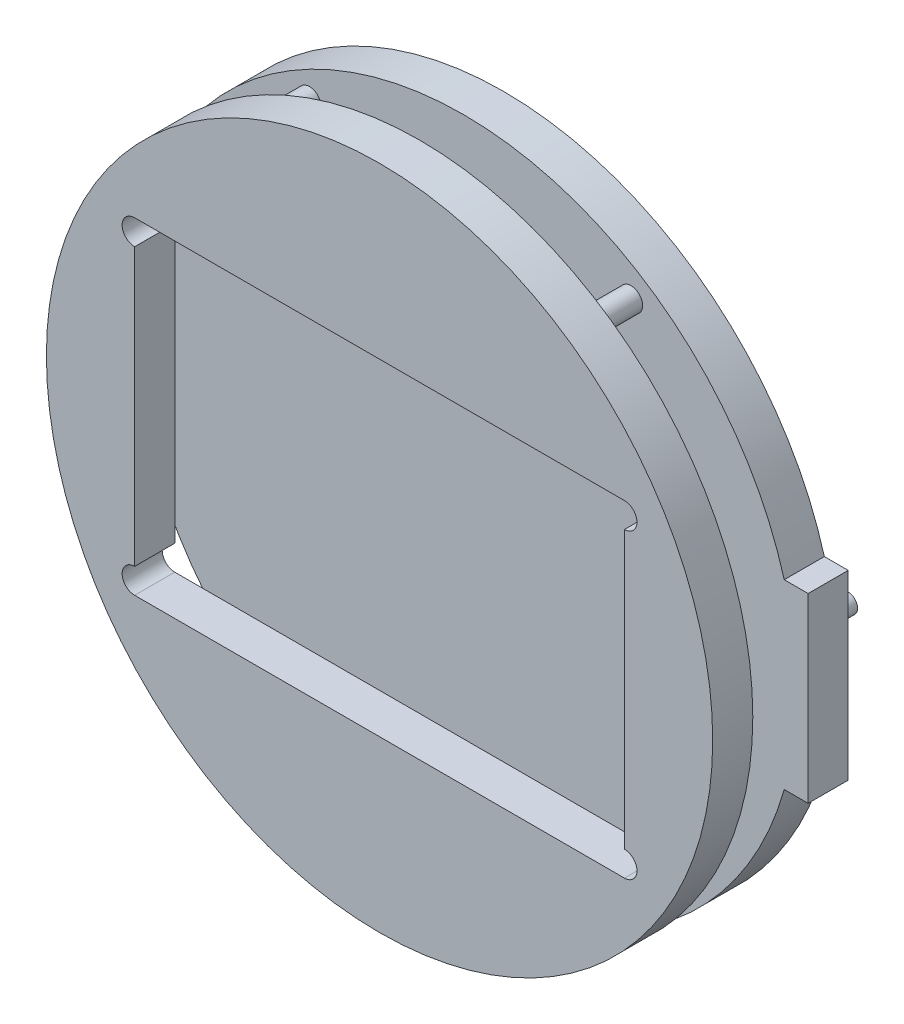
ISO-10303-21;
HEADER;
FILE_DESCRIPTION(('STEP AP214'),'2;1');
FILE_NAME('part.step','',(''),(''),'','','');
FILE_SCHEMA(('AUTOMOTIVE_DESIGN { 1 0 10303 214 1 1 1 1 }'));
ENDSEC;
DATA;
#1=APPLICATION_CONTEXT('core data for automotive mechanical design processes');
#2=APPLICATION_PROTOCOL_DEFINITION('international standard','automotive_design',2000,#1);
#3=PRODUCT_CONTEXT('',#1,'mechanical');
#4=PRODUCT('Part','Part','',(#3));
#5=PRODUCT_RELATED_PRODUCT_CATEGORY('part','',(#4));
#6=PRODUCT_DEFINITION_FORMATION('','',#4);
#7=PRODUCT_DEFINITION_CONTEXT('part definition',#1,'design');
#8=PRODUCT_DEFINITION('design','',#6,#7);
#9=PRODUCT_DEFINITION_SHAPE('','',#8);
#10=(LENGTH_UNIT() NAMED_UNIT(*) SI_UNIT(.MILLI.,.METRE.));
#11=(NAMED_UNIT(*) PLANE_ANGLE_UNIT() SI_UNIT($,.RADIAN.));
#12=(NAMED_UNIT(*) SI_UNIT($,.STERADIAN.) SOLID_ANGLE_UNIT());
#13=UNCERTAINTY_MEASURE_WITH_UNIT(LENGTH_MEASURE(1.E-05),#10,'distance_accuracy_value','');
#14=(GEOMETRIC_REPRESENTATION_CONTEXT(3) GLOBAL_UNCERTAINTY_ASSIGNED_CONTEXT((#13)) GLOBAL_UNIT_ASSIGNED_CONTEXT((#10,
#11,#12)) REPRESENTATION_CONTEXT('',''));
#15=CARTESIAN_POINT('',(0.,0.,0.));
#16=DIRECTION('',(0.,0.,1.));
#17=DIRECTION('',(1.,0.,0.));
#18=AXIS2_PLACEMENT_3D('',#15,#16,#17);
#19=CARTESIAN_POINT('',(0.,0.,-3.4036));
#20=DIRECTION('',(0.,0.,-1.));
#21=DIRECTION('',(-1.,0.,0.));
#22=AXIS2_PLACEMENT_3D('',#19,#20,#21);
#23=PLANE('',#22);
#24=CARTESIAN_POINT('',(11.43,0.,-3.4036));
#25=DIRECTION('',(0.,0.,-1.));
#26=DIRECTION('',(-1.,0.,0.));
#27=AXIS2_PLACEMENT_3D('',#24,#25,#26);
#28=CIRCLE('',#27,0.381000000000001);
#29=CARTESIAN_POINT('',(11.049,0.,-3.4036));
#30=VERTEX_POINT('',#29);
#31=EDGE_CURVE('E177',#30,#30,#28,.T.);
#32=ORIENTED_EDGE('',*,*,#31,.F.);
#33=EDGE_LOOP('',(#32));
#34=FACE_BOUND('',#33,.T.);
#35=CARTESIAN_POINT('',(0.,0.,-3.4036));
#36=DIRECTION('',(0.,0.,-1.));
#37=DIRECTION('',(-1.,0.,0.));
#38=AXIS2_PLACEMENT_3D('',#35,#36,#37);
#39=CIRCLE('',#38,13.5128);
#40=CARTESIAN_POINT('',(-13.001202822816,3.683,-3.4036));
#41=VERTEX_POINT('',#40);
#42=CARTESIAN_POINT('',(13.001202822816,3.683,-3.4036));
#43=VERTEX_POINT('',#42);
#44=EDGE_CURVE('E204',#41,#43,#39,.T.);
#45=ORIENTED_EDGE('',*,*,#44,.T.);
#46=DIRECTION('',(1.,0.,0.));
#47=VECTOR('',#46,1.);
#48=CARTESIAN_POINT('',(13.97,3.683,-3.4036));
#49=LINE('',#48,#47);
#50=CARTESIAN_POINT('',(13.97,3.683,-3.4036));
#51=VERTEX_POINT('',#50);
#52=EDGE_CURVE('E167',#43,#51,#49,.T.);
#53=ORIENTED_EDGE('',*,*,#52,.T.);
#54=DIRECTION('',(0.,-1.,0.));
#55=VECTOR('',#54,1.);
#56=CARTESIAN_POINT('',(13.97,3.683,-3.4036));
#57=LINE('',#56,#55);
#58=CARTESIAN_POINT('',(13.97,-3.683,-3.4036));
#59=VERTEX_POINT('',#58);
#60=EDGE_CURVE('E166',#51,#59,#57,.T.);
#61=ORIENTED_EDGE('',*,*,#60,.T.);
#62=DIRECTION('',(-1.,0.,0.));
#63=VECTOR('',#62,1.);
#64=CARTESIAN_POINT('',(13.97,-3.683,-3.4036));
#65=LINE('',#64,#63);
#66=CARTESIAN_POINT('',(13.001202822816,-3.683,-3.4036));
#67=VERTEX_POINT('',#66);
#68=EDGE_CURVE('E157',#59,#67,#65,.T.);
#69=ORIENTED_EDGE('',*,*,#68,.T.);
#70=CARTESIAN_POINT('',(-13.001202822816,-3.683,-3.4036));
#71=VERTEX_POINT('',#70);
#72=EDGE_CURVE('E207',#67,#71,#39,.T.);
#73=ORIENTED_EDGE('',*,*,#72,.T.);
#74=CARTESIAN_POINT('',(-13.97,-3.683,-3.4036));
#75=VERTEX_POINT('',#74);
#76=EDGE_CURVE('E172',#71,#75,#65,.T.);
#77=ORIENTED_EDGE('',*,*,#76,.T.);
#78=DIRECTION('',(0.,1.,0.));
#79=VECTOR('',#78,1.);
#80=CARTESIAN_POINT('',(-13.97,3.683,-3.4036));
#81=LINE('',#80,#79);
#82=CARTESIAN_POINT('',(-13.97,3.683,-3.4036));
#83=VERTEX_POINT('',#82);
#84=EDGE_CURVE('E152',#75,#83,#81,.T.);
#85=ORIENTED_EDGE('',*,*,#84,.T.);
#86=EDGE_CURVE('E161',#83,#41,#49,.T.);
#87=ORIENTED_EDGE('',*,*,#86,.T.);
#88=EDGE_LOOP('',(#45,#53,#61,#69,#73,#77,#85,#87));
#89=FACE_BOUND('',#88,.T.);
#90=CARTESIAN_POINT('',(-11.43,0.,-3.4036));
#91=DIRECTION('',(0.,0.,-1.));
#92=DIRECTION('',(1.,0.,0.));
#93=AXIS2_PLACEMENT_3D('',#90,#91,#92);
#94=CIRCLE('',#93,0.381000000000001);
#95=CARTESIAN_POINT('',(-11.049,0.,-3.4036));
#96=VERTEX_POINT('',#95);
#97=EDGE_CURVE('E373',#96,#96,#94,.T.);
#98=ORIENTED_EDGE('',*,*,#97,.F.);
#99=EDGE_LOOP('',(#98));
#100=FACE_BOUND('',#99,.T.);
#101=ADVANCED_FACE('F33',(#34,#89,#100),#23,.T.);
#102=CARTESIAN_POINT('',(0.,0.,-3.4036));
#103=DIRECTION('',(0.,0.,1.));
#104=DIRECTION('',(1.,0.,0.));
#105=AXIS2_PLACEMENT_3D('',#102,#103,#104);
#106=CYLINDRICAL_SURFACE('',#105,13.5128);
#107=ORIENTED_EDGE('',*,*,#72,.F.);
#108=DIRECTION('',(0.,0.,1.));
#109=VECTOR('',#108,1.);
#110=CARTESIAN_POINT('',(13.001202822816,-3.683,-3.4036));
#111=LINE('',#110,#109);
#112=CARTESIAN_POINT('',(13.001202822816,-3.683,-1.778));
#113=VERTEX_POINT('',#112);
#114=EDGE_CURVE('E202',#67,#113,#111,.T.);
#115=ORIENTED_EDGE('',*,*,#114,.T.);
#116=CARTESIAN_POINT('',(0.,0.,-1.778));
#117=DIRECTION('',(0.,0.,-1.));
#118=DIRECTION('',(-1.,0.,0.));
#119=AXIS2_PLACEMENT_3D('',#116,#117,#118);
#120=CIRCLE('',#119,13.5128);
#121=CARTESIAN_POINT('',(-13.001202822816,-3.683,-1.778));
#122=VERTEX_POINT('',#121);
#123=EDGE_CURVE('E48',#113,#122,#120,.T.);
#124=ORIENTED_EDGE('',*,*,#123,.T.);
#125=DIRECTION('',(0.,0.,1.));
#126=VECTOR('',#125,1.);
#127=CARTESIAN_POINT('',(-13.001202822816,-3.683,-3.4036));
#128=LINE('',#127,#126);
#129=EDGE_CURVE('E200',#122,#71,#128,.F.);
#130=ORIENTED_EDGE('',*,*,#129,.T.);
#131=EDGE_LOOP('',(#107,#115,#124,#130));
#132=FACE_BOUND('',#131,.T.);
#133=ADVANCED_FACE('F305',(#132),#106,.T.);
#134=CARTESIAN_POINT('',(0.,0.,0.));
#135=DIRECTION('',(0.,0.,1.));
#136=DIRECTION('',(1.,0.,0.));
#137=AXIS2_PLACEMENT_3D('',#134,#135,#136);
#138=PLANE('',#137);
#139=CARTESIAN_POINT('',(-5.42225666710933,-10.7623579301716,0.));
#140=DIRECTION('',(0.,0.,1.));
#141=DIRECTION('',(1.,0.,0.));
#142=AXIS2_PLACEMENT_3D('',#139,#140,#141);
#143=CIRCLE('',#142,0.612350227227674);
#144=CARTESIAN_POINT('',(-4.80990643988165,-10.7623579301716,0.));
#145=VERTEX_POINT('',#144);
#146=EDGE_CURVE('E41',#145,#145,#143,.F.);
#147=ORIENTED_EDGE('',*,*,#146,.F.);
#148=EDGE_LOOP('',(#147));
#149=FACE_BOUND('',#148,.T.);
#150=CARTESIAN_POINT('',(6.79151340122786,10.4337363139831,0.));
#151=DIRECTION('',(0.,0.,1.));
#152=DIRECTION('',(1.,0.,0.));
#153=AXIS2_PLACEMENT_3D('',#150,#151,#152);
#154=CIRCLE('',#153,0.467957386584394);
#155=CARTESIAN_POINT('',(7.25947078781225,10.4337363139831,0.));
#156=VERTEX_POINT('',#155);
#157=EDGE_CURVE('E292',#156,#156,#154,.F.);
#158=ORIENTED_EDGE('',*,*,#157,.F.);
#159=EDGE_LOOP('',(#158));
#160=FACE_BOUND('',#159,.T.);
#161=DIRECTION('',(0.,1.,0.));
#162=VECTOR('',#161,1.);
#163=CARTESIAN_POINT('',(9.927,6.627,0.));
#164=LINE('',#163,#162);
#165=CARTESIAN_POINT('',(9.927,-5.611,0.));
#166=VERTEX_POINT('',#165);
#167=CARTESIAN_POINT('',(9.927,5.611,0.));
#168=VERTEX_POINT('',#167);
#169=EDGE_CURVE('E257',#166,#168,#164,.T.);
#170=ORIENTED_EDGE('',*,*,#169,.T.);
#171=CARTESIAN_POINT('',(9.927,6.119,0.));
#172=DIRECTION('',(0.,0.,1.));
#173=DIRECTION('',(1.,0.,0.));
#174=AXIS2_PLACEMENT_3D('',#171,#172,#173);
#175=CIRCLE('',#174,0.508);
#176=CARTESIAN_POINT('',(9.927,6.627,0.));
#177=VERTEX_POINT('',#176);
#178=EDGE_CURVE('E221',#168,#177,#175,.T.);
#179=ORIENTED_EDGE('',*,*,#178,.T.);
#180=DIRECTION('',(-1.,0.,0.));
#181=VECTOR('',#180,1.);
#182=CARTESIAN_POINT('',(-9.927,6.627,0.));
#183=LINE('',#182,#181);
#184=CARTESIAN_POINT('',(-9.927,6.627,0.));
#185=VERTEX_POINT('',#184);
#186=EDGE_CURVE('E260',#177,#185,#183,.T.);
#187=ORIENTED_EDGE('',*,*,#186,.T.);
#188=CARTESIAN_POINT('',(-9.927,6.119,0.));
#189=DIRECTION('',(0.,0.,1.));
#190=DIRECTION('',(1.,0.,0.));
#191=AXIS2_PLACEMENT_3D('',#188,#189,#190);
#192=CIRCLE('',#191,0.508);
#193=CARTESIAN_POINT('',(-9.927,5.611,0.));
#194=VERTEX_POINT('',#193);
#195=EDGE_CURVE('E242',#185,#194,#192,.T.);
#196=ORIENTED_EDGE('',*,*,#195,.T.);
#197=DIRECTION('',(0.,-1.,0.));
#198=VECTOR('',#197,1.);
#199=CARTESIAN_POINT('',(-9.927,6.627,0.));
#200=LINE('',#199,#198);
#201=CARTESIAN_POINT('',(-9.927,-5.611,0.));
#202=VERTEX_POINT('',#201);
#203=EDGE_CURVE('E250',#194,#202,#200,.T.);
#204=ORIENTED_EDGE('',*,*,#203,.T.);
#205=CARTESIAN_POINT('',(-9.927,-6.119,0.));
#206=DIRECTION('',(0.,0.,1.));
#207=DIRECTION('',(1.,0.,0.));
#208=AXIS2_PLACEMENT_3D('',#205,#206,#207);
#209=CIRCLE('',#208,0.508);
#210=CARTESIAN_POINT('',(-9.927,-6.627,0.));
#211=VERTEX_POINT('',#210);
#212=EDGE_CURVE('E234',#202,#211,#209,.T.);
#213=ORIENTED_EDGE('',*,*,#212,.T.);
#214=DIRECTION('',(1.,0.,0.));
#215=VECTOR('',#214,1.);
#216=CARTESIAN_POINT('',(-9.927,-6.627,0.));
#217=LINE('',#216,#215);
#218=CARTESIAN_POINT('',(9.927,-6.627,0.));
#219=VERTEX_POINT('',#218);
#220=EDGE_CURVE('E253',#211,#219,#217,.T.);
#221=ORIENTED_EDGE('',*,*,#220,.T.);
#222=CARTESIAN_POINT('',(9.927,-6.119,0.));
#223=DIRECTION('',(0.,0.,1.));
#224=DIRECTION('',(1.,0.,0.));
#225=AXIS2_PLACEMENT_3D('',#222,#223,#224);
#226=CIRCLE('',#225,0.508);
#227=EDGE_CURVE('E226',#219,#166,#226,.T.);
#228=ORIENTED_EDGE('',*,*,#227,.T.);
#229=EDGE_LOOP('',(#170,#179,#187,#196,#204,#213,#221,#228));
#230=FACE_BOUND('',#229,.T.);
#231=CARTESIAN_POINT('',(0.,0.,0.));
#232=DIRECTION('',(0.,0.,1.));
#233=DIRECTION('',(1.,0.,0.));
#234=AXIS2_PLACEMENT_3D('',#231,#232,#233);
#235=CIRCLE('',#234,13.5054047484067);
#236=CARTESIAN_POINT('',(13.5054047484067,0.,0.));
#237=VERTEX_POINT('',#236);
#238=EDGE_CURVE('E276',#237,#237,#235,.T.);
#239=ORIENTED_EDGE('',*,*,#238,.F.);
#240=EDGE_LOOP('',(#239));
#241=FACE_BOUND('',#240,.T.);
#242=CARTESIAN_POINT('',(-6.24381070758044,10.9016937005675,0.));
#243=DIRECTION('',(0.,0.,1.));
#244=DIRECTION('',(1.,0.,0.));
#245=AXIS2_PLACEMENT_3D('',#242,#243,#244);
#246=CIRCLE('',#245,0.47115167203904);
#247=CARTESIAN_POINT('',(-5.7726590355414,10.9016937005675,0.));
#248=VERTEX_POINT('',#247);
#249=EDGE_CURVE('E295',#248,#248,#246,.F.);
#250=ORIENTED_EDGE('',*,*,#249,.F.);
#251=EDGE_LOOP('',(#250));
#252=FACE_BOUND('',#251,.T.);
#253=CARTESIAN_POINT('',(6.79151340122786,-10.1500077029439,0.));
#254=DIRECTION('',(0.,0.,1.));
#255=DIRECTION('',(1.,0.,0.));
#256=AXIS2_PLACEMENT_3D('',#253,#254,#255);
#257=CIRCLE('',#256,0.612350227227674);
#258=CARTESIAN_POINT('',(7.40386362845553,-10.1500077029439,0.));
#259=VERTEX_POINT('',#258);
#260=EDGE_CURVE('E11',#259,#259,#257,.F.);
#261=ORIENTED_EDGE('',*,*,#260,.F.);
#262=EDGE_LOOP('',(#261));
#263=FACE_BOUND('',#262,.T.);
#264=ADVANCED_FACE('F302',(#149,#160,#230,#241,#252,#263),#138,.F.);
#265=CARTESIAN_POINT('',(0.,0.,1.6256));
#266=DIRECTION('',(0.,0.,-1.));
#267=DIRECTION('',(-1.,0.,0.));
#268=AXIS2_PLACEMENT_3D('',#265,#266,#267);
#269=CYLINDRICAL_SURFACE('',#268,13.5054047484067);
#270=CARTESIAN_POINT('',(0.,0.,1.6256));
#271=DIRECTION('',(0.,0.,1.));
#272=DIRECTION('',(1.,0.,0.));
#273=AXIS2_PLACEMENT_3D('',#270,#271,#272);
#274=CIRCLE('',#273,13.5054047484067);
#275=CARTESIAN_POINT('',(13.5054047484067,0.,1.6256));
#276=VERTEX_POINT('',#275);
#277=EDGE_CURVE('E284',#276,#276,#274,.T.);
#278=ORIENTED_EDGE('',*,*,#277,.F.);
#279=EDGE_LOOP('',(#278));
#280=FACE_BOUND('',#279,.T.);
#281=ORIENTED_EDGE('',*,*,#238,.T.);
#282=EDGE_LOOP('',(#281));
#283=FACE_BOUND('',#282,.T.);
#284=ADVANCED_FACE('F35',(#280,#283),#269,.T.);
#285=CARTESIAN_POINT('',(0.,0.,1.6256));
#286=DIRECTION('',(0.,0.,1.));
#287=DIRECTION('',(1.,0.,0.));
#288=AXIS2_PLACEMENT_3D('',#285,#286,#287);
#289=PLANE('',#288);
#290=CARTESIAN_POINT('',(9.927,6.119,1.6256));
#291=DIRECTION('',(0.,0.,1.));
#292=DIRECTION('',(1.,0.,0.));
#293=AXIS2_PLACEMENT_3D('',#290,#291,#292);
#294=CIRCLE('',#293,0.508);
#295=CARTESIAN_POINT('',(9.927,5.611,1.6256));
#296=VERTEX_POINT('',#295);
#297=CARTESIAN_POINT('',(9.927,6.627,1.6256));
#298=VERTEX_POINT('',#297);
#299=EDGE_CURVE('E220',#296,#298,#294,.T.);
#300=ORIENTED_EDGE('',*,*,#299,.F.);
#301=DIRECTION('',(0.,1.,0.));
#302=VECTOR('',#301,1.);
#303=CARTESIAN_POINT('',(9.927,6.627,1.6256));
#304=LINE('',#303,#302);
#305=CARTESIAN_POINT('',(9.927,-5.611,1.6256));
#306=VERTEX_POINT('',#305);
#307=EDGE_CURVE('E269',#306,#296,#304,.T.);
#308=ORIENTED_EDGE('',*,*,#307,.F.);
#309=CARTESIAN_POINT('',(9.927,-6.119,1.6256));
#310=DIRECTION('',(0.,0.,1.));
#311=DIRECTION('',(1.,0.,0.));
#312=AXIS2_PLACEMENT_3D('',#309,#310,#311);
#313=CIRCLE('',#312,0.508);
#314=CARTESIAN_POINT('',(9.927,-6.627,1.6256));
#315=VERTEX_POINT('',#314);
#316=EDGE_CURVE('E224',#315,#306,#313,.T.);
#317=ORIENTED_EDGE('',*,*,#316,.F.);
#318=DIRECTION('',(1.,0.,0.));
#319=VECTOR('',#318,1.);
#320=CARTESIAN_POINT('',(-9.927,-6.627,1.6256));
#321=LINE('',#320,#319);
#322=CARTESIAN_POINT('',(-9.927,-6.627,1.6256));
#323=VERTEX_POINT('',#322);
#324=EDGE_CURVE('E266',#323,#315,#321,.T.);
#325=ORIENTED_EDGE('',*,*,#324,.F.);
#326=CARTESIAN_POINT('',(-9.927,-6.119,1.6256));
#327=DIRECTION('',(0.,0.,1.));
#328=DIRECTION('',(1.,0.,0.));
#329=AXIS2_PLACEMENT_3D('',#326,#327,#328);
#330=CIRCLE('',#329,0.508);
#331=CARTESIAN_POINT('',(-9.927,-5.611,1.6256));
#332=VERTEX_POINT('',#331);
#333=EDGE_CURVE('E233',#332,#323,#330,.T.);
#334=ORIENTED_EDGE('',*,*,#333,.F.);
#335=DIRECTION('',(0.,-1.,0.));
#336=VECTOR('',#335,1.);
#337=CARTESIAN_POINT('',(-9.927,6.627,1.6256));
#338=LINE('',#337,#336);
#339=CARTESIAN_POINT('',(-9.927,5.611,1.6256));
#340=VERTEX_POINT('',#339);
#341=EDGE_CURVE('E249',#340,#332,#338,.T.);
#342=ORIENTED_EDGE('',*,*,#341,.F.);
#343=CARTESIAN_POINT('',(-9.927,6.119,1.6256));
#344=DIRECTION('',(0.,0.,1.));
#345=DIRECTION('',(1.,0.,0.));
#346=AXIS2_PLACEMENT_3D('',#343,#344,#345);
#347=CIRCLE('',#346,0.508);
#348=CARTESIAN_POINT('',(-9.927,6.627,1.6256));
#349=VERTEX_POINT('',#348);
#350=EDGE_CURVE('E241',#349,#340,#347,.T.);
#351=ORIENTED_EDGE('',*,*,#350,.F.);
#352=DIRECTION('',(-1.,0.,0.));
#353=VECTOR('',#352,1.);
#354=CARTESIAN_POINT('',(-9.927,6.627,1.6256));
#355=LINE('',#354,#353);
#356=EDGE_CURVE('E254',#298,#349,#355,.T.);
#357=ORIENTED_EDGE('',*,*,#356,.F.);
#358=EDGE_LOOP('',(#300,#308,#317,#325,#334,#342,#351,#357));
#359=FACE_BOUND('',#358,.T.);
#360=ORIENTED_EDGE('',*,*,#277,.T.);
#361=EDGE_LOOP('',(#360));
#362=FACE_BOUND('',#361,.T.);
#363=ADVANCED_FACE('F598',(#359,#362),#289,.T.);
#364=CARTESIAN_POINT('',(-9.927,6.627,0.));
#365=DIRECTION('',(-1.,0.,0.));
#366=DIRECTION('',(0.,0.,1.));
#367=AXIS2_PLACEMENT_3D('',#364,#365,#366);
#368=PLANE('',#367);
#369=ORIENTED_EDGE('',*,*,#341,.T.);
#370=DIRECTION('',(0.,0.,1.));
#371=VECTOR('',#370,1.);
#372=CARTESIAN_POINT('',(-9.927,-5.611,0.));
#373=LINE('',#372,#371);
#374=EDGE_CURVE('E237',#332,#202,#373,.F.);
#375=ORIENTED_EDGE('',*,*,#374,.T.);
#376=ORIENTED_EDGE('',*,*,#203,.F.);
#377=DIRECTION('',(0.,0.,1.));
#378=VECTOR('',#377,1.);
#379=CARTESIAN_POINT('',(-9.927,5.611,0.));
#380=LINE('',#379,#378);
#381=EDGE_CURVE('E245',#194,#340,#380,.T.);
#382=ORIENTED_EDGE('',*,*,#381,.T.);
#383=EDGE_LOOP('',(#369,#375,#376,#382));
#384=FACE_BOUND('',#383,.T.);
#385=ADVANCED_FACE('F588',(#384),#368,.F.);
#386=CARTESIAN_POINT('',(-9.927,6.627,0.));
#387=DIRECTION('',(0.,1.,0.));
#388=DIRECTION('',(0.,0.,1.));
#389=AXIS2_PLACEMENT_3D('',#386,#387,#388);
#390=PLANE('',#389);
#391=ORIENTED_EDGE('',*,*,#356,.T.);
#392=DIRECTION('',(0.,0.,1.));
#393=VECTOR('',#392,1.);
#394=CARTESIAN_POINT('',(-9.927,6.627,0.));
#395=LINE('',#394,#393);
#396=EDGE_CURVE('E274',#185,#349,#395,.T.);
#397=ORIENTED_EDGE('',*,*,#396,.F.);
#398=ORIENTED_EDGE('',*,*,#186,.F.);
#399=DIRECTION('',(0.,0.,1.));
#400=VECTOR('',#399,1.);
#401=CARTESIAN_POINT('',(9.927,6.627,0.));
#402=LINE('',#401,#400);
#403=EDGE_CURVE('E277',#177,#298,#402,.T.);
#404=ORIENTED_EDGE('',*,*,#403,.T.);
#405=EDGE_LOOP('',(#391,#397,#398,#404));
#406=FACE_BOUND('',#405,.T.);
#407=ADVANCED_FACE('F578',(#406),#390,.F.);
#408=CARTESIAN_POINT('',(9.927,6.627,0.));
#409=DIRECTION('',(1.,0.,0.));
#410=DIRECTION('',(0.,0.,-1.));
#411=AXIS2_PLACEMENT_3D('',#408,#409,#410);
#412=PLANE('',#411);
#413=ORIENTED_EDGE('',*,*,#307,.T.);
#414=DIRECTION('',(0.,0.,1.));
#415=VECTOR('',#414,1.);
#416=CARTESIAN_POINT('',(9.927,5.611,0.));
#417=LINE('',#416,#415);
#418=EDGE_CURVE('E287',#296,#168,#417,.F.);
#419=ORIENTED_EDGE('',*,*,#418,.T.);
#420=ORIENTED_EDGE('',*,*,#169,.F.);
#421=DIRECTION('',(0.,0.,1.));
#422=VECTOR('',#421,1.);
#423=CARTESIAN_POINT('',(9.927,-5.611,0.));
#424=LINE('',#423,#422);
#425=EDGE_CURVE('E229',#166,#306,#424,.T.);
#426=ORIENTED_EDGE('',*,*,#425,.T.);
#427=EDGE_LOOP('',(#413,#419,#420,#426));
#428=FACE_BOUND('',#427,.T.);
#429=ADVANCED_FACE('F568',(#428),#412,.F.);
#430=CARTESIAN_POINT('',(-9.927,-6.627,0.));
#431=DIRECTION('',(0.,-1.,0.));
#432=DIRECTION('',(0.,0.,-1.));
#433=AXIS2_PLACEMENT_3D('',#430,#431,#432);
#434=PLANE('',#433);
#435=ORIENTED_EDGE('',*,*,#324,.T.);
#436=DIRECTION('',(0.,0.,1.));
#437=VECTOR('',#436,1.);
#438=CARTESIAN_POINT('',(9.927,-6.627,0.));
#439=LINE('',#438,#437);
#440=EDGE_CURVE('E280',#219,#315,#439,.T.);
#441=ORIENTED_EDGE('',*,*,#440,.F.);
#442=ORIENTED_EDGE('',*,*,#220,.F.);
#443=DIRECTION('',(0.,0.,1.));
#444=VECTOR('',#443,1.);
#445=CARTESIAN_POINT('',(-9.927,-6.627,0.));
#446=LINE('',#445,#444);
#447=EDGE_CURVE('E263',#211,#323,#446,.T.);
#448=ORIENTED_EDGE('',*,*,#447,.T.);
#449=EDGE_LOOP('',(#435,#441,#442,#448));
#450=FACE_BOUND('',#449,.T.);
#451=ADVANCED_FACE('F558',(#450),#434,.F.);
#452=CARTESIAN_POINT('',(-9.927,6.119,0.));
#453=DIRECTION('',(0.,0.,1.));
#454=DIRECTION('',(1.,0.,0.));
#455=AXIS2_PLACEMENT_3D('',#452,#453,#454);
#456=CYLINDRICAL_SURFACE('',#455,0.508);
#457=ORIENTED_EDGE('',*,*,#195,.F.);
#458=ORIENTED_EDGE('',*,*,#396,.T.);
#459=ORIENTED_EDGE('',*,*,#350,.T.);
#460=ORIENTED_EDGE('',*,*,#381,.F.);
#461=EDGE_LOOP('',(#457,#458,#459,#460));
#462=FACE_BOUND('',#461,.T.);
#463=ADVANCED_FACE('F548',(#462),#456,.F.);
#464=CARTESIAN_POINT('',(-9.927,-6.119,0.));
#465=DIRECTION('',(0.,0.,1.));
#466=DIRECTION('',(1.,0.,0.));
#467=AXIS2_PLACEMENT_3D('',#464,#465,#466);
#468=CYLINDRICAL_SURFACE('',#467,0.508);
#469=ORIENTED_EDGE('',*,*,#333,.T.);
#470=ORIENTED_EDGE('',*,*,#447,.F.);
#471=ORIENTED_EDGE('',*,*,#212,.F.);
#472=ORIENTED_EDGE('',*,*,#374,.F.);
#473=EDGE_LOOP('',(#469,#470,#471,#472));
#474=FACE_BOUND('',#473,.T.);
#475=ADVANCED_FACE('F538',(#474),#468,.F.);
#476=CARTESIAN_POINT('',(9.927,-6.119,0.));
#477=DIRECTION('',(0.,0.,1.));
#478=DIRECTION('',(1.,0.,0.));
#479=AXIS2_PLACEMENT_3D('',#476,#477,#478);
#480=CYLINDRICAL_SURFACE('',#479,0.508);
#481=ORIENTED_EDGE('',*,*,#227,.F.);
#482=ORIENTED_EDGE('',*,*,#440,.T.);
#483=ORIENTED_EDGE('',*,*,#316,.T.);
#484=ORIENTED_EDGE('',*,*,#425,.F.);
#485=EDGE_LOOP('',(#481,#482,#483,#484));
#486=FACE_BOUND('',#485,.T.);
#487=ADVANCED_FACE('F528',(#486),#480,.F.);
#488=CARTESIAN_POINT('',(9.927,6.119,0.));
#489=DIRECTION('',(0.,0.,1.));
#490=DIRECTION('',(1.,0.,0.));
#491=AXIS2_PLACEMENT_3D('',#488,#489,#490);
#492=CYLINDRICAL_SURFACE('',#491,0.508);
#493=ORIENTED_EDGE('',*,*,#178,.F.);
#494=ORIENTED_EDGE('',*,*,#418,.F.);
#495=ORIENTED_EDGE('',*,*,#299,.T.);
#496=ORIENTED_EDGE('',*,*,#403,.F.);
#497=EDGE_LOOP('',(#493,#494,#495,#496));
#498=FACE_BOUND('',#497,.T.);
#499=ADVANCED_FACE('F511',(#498),#492,.F.);
#500=CARTESIAN_POINT('',(6.79151340122786,10.4337363139831,-1.778));
#501=DIRECTION('',(0.,0.,1.));
#502=DIRECTION('',(1.,0.,0.));
#503=AXIS2_PLACEMENT_3D('',#500,#501,#502);
#504=CYLINDRICAL_SURFACE('',#503,0.467957386584394);
#505=CARTESIAN_POINT('',(6.79151340122786,10.4337363139831,-1.778));
#506=DIRECTION('',(0.,0.,-1.));
#507=DIRECTION('',(-1.,0.,0.));
#508=AXIS2_PLACEMENT_3D('',#505,#506,#507);
#509=CIRCLE('',#508,0.467957386584394);
#510=CARTESIAN_POINT('',(6.32355601464346,10.4337363139831,-1.778));
#511=VERTEX_POINT('',#510);
#512=EDGE_CURVE('E217',#511,#511,#509,.T.);
#513=ORIENTED_EDGE('',*,*,#512,.F.);
#514=EDGE_LOOP('',(#513));
#515=FACE_BOUND('',#514,.T.);
#516=ORIENTED_EDGE('',*,*,#157,.T.);
#517=EDGE_LOOP('',(#516));
#518=FACE_BOUND('',#517,.T.);
#519=ADVANCED_FACE('F501',(#515,#518),#504,.T.);
#520=CARTESIAN_POINT('',(-6.24381070758044,10.9016937005675,-1.778));
#521=DIRECTION('',(0.,0.,1.));
#522=DIRECTION('',(1.,0.,0.));
#523=AXIS2_PLACEMENT_3D('',#520,#521,#522);
#524=CYLINDRICAL_SURFACE('',#523,0.47115167203904);
#525=CARTESIAN_POINT('',(-6.24381070758044,10.9016937005675,-1.778));
#526=DIRECTION('',(0.,0.,-1.));
#527=DIRECTION('',(-1.,0.,0.));
#528=AXIS2_PLACEMENT_3D('',#525,#526,#527);
#529=CIRCLE('',#528,0.47115167203904);
#530=CARTESIAN_POINT('',(-6.71496237961948,10.9016937005675,-1.778));
#531=VERTEX_POINT('',#530);
#532=EDGE_CURVE('E214',#531,#531,#529,.T.);
#533=ORIENTED_EDGE('',*,*,#532,.F.);
#534=EDGE_LOOP('',(#533));
#535=FACE_BOUND('',#534,.T.);
#536=ORIENTED_EDGE('',*,*,#249,.T.);
#537=EDGE_LOOP('',(#536));
#538=FACE_BOUND('',#537,.T.);
#539=ADVANCED_FACE('F328',(#535,#538),#524,.T.);
#540=CARTESIAN_POINT('',(-5.42225666710933,-10.7623579301716,-1.778));
#541=DIRECTION('',(0.,0.,1.));
#542=DIRECTION('',(1.,0.,0.));
#543=AXIS2_PLACEMENT_3D('',#540,#541,#542);
#544=CYLINDRICAL_SURFACE('',#543,0.612350227227674);
#545=CARTESIAN_POINT('',(-5.42225666710933,-10.7623579301716,-1.778));
#546=DIRECTION('',(0.,0.,-1.));
#547=DIRECTION('',(-1.,0.,0.));
#548=AXIS2_PLACEMENT_3D('',#545,#546,#547);
#549=CIRCLE('',#548,0.612350227227674);
#550=CARTESIAN_POINT('',(-6.034606894337,-10.7623579301716,-1.778));
#551=VERTEX_POINT('',#550);
#552=EDGE_CURVE('E211',#551,#551,#549,.T.);
#553=ORIENTED_EDGE('',*,*,#552,.F.);
#554=EDGE_LOOP('',(#553));
#555=FACE_BOUND('',#554,.T.);
#556=ORIENTED_EDGE('',*,*,#146,.T.);
#557=EDGE_LOOP('',(#556));
#558=FACE_BOUND('',#557,.T.);
#559=ADVANCED_FACE('F300',(#555,#558),#544,.T.);
#560=CARTESIAN_POINT('',(6.79151340122786,-10.1500077029439,-1.778));
#561=DIRECTION('',(0.,0.,1.));
#562=DIRECTION('',(1.,0.,0.));
#563=AXIS2_PLACEMENT_3D('',#560,#561,#562);
#564=CYLINDRICAL_SURFACE('',#563,0.612350227227674);
#565=CARTESIAN_POINT('',(6.79151340122786,-10.1500077029439,-1.778));
#566=DIRECTION('',(0.,0.,-1.));
#567=DIRECTION('',(-1.,0.,0.));
#568=AXIS2_PLACEMENT_3D('',#565,#566,#567);
#569=CIRCLE('',#568,0.612350227227674);
#570=CARTESIAN_POINT('',(6.17916317400018,-10.1500077029439,-1.778));
#571=VERTEX_POINT('',#570);
#572=EDGE_CURVE('E206',#571,#571,#569,.T.);
#573=ORIENTED_EDGE('',*,*,#572,.F.);
#574=EDGE_LOOP('',(#573));
#575=FACE_BOUND('',#574,.T.);
#576=ORIENTED_EDGE('',*,*,#260,.T.);
#577=EDGE_LOOP('',(#576));
#578=FACE_BOUND('',#577,.T.);
#579=ADVANCED_FACE('F316',(#575,#578),#564,.T.);
#580=CARTESIAN_POINT('',(0.,0.,-1.778));
#581=DIRECTION('',(0.,0.,-1.));
#582=DIRECTION('',(-1.,0.,0.));
#583=AXIS2_PLACEMENT_3D('',#580,#581,#582);
#584=PLANE('',#583);
#585=ORIENTED_EDGE('',*,*,#532,.T.);
#586=EDGE_LOOP('',(#585));
#587=FACE_BOUND('',#586,.T.);
#588=CARTESIAN_POINT('',(-13.001202822816,3.683,-1.778));
#589=VERTEX_POINT('',#588);
#590=CARTESIAN_POINT('',(13.001202822816,3.683,-1.778));
#591=VERTEX_POINT('',#590);
#592=EDGE_CURVE('E56',#589,#591,#120,.T.);
#593=ORIENTED_EDGE('',*,*,#592,.F.);
#594=DIRECTION('',(-1.,0.,0.));
#595=VECTOR('',#594,1.);
#596=CARTESIAN_POINT('',(13.97,3.683,-1.778));
#597=LINE('',#596,#595);
#598=CARTESIAN_POINT('',(-13.97,3.683,-1.778));
#599=VERTEX_POINT('',#598);
#600=EDGE_CURVE('E197',#589,#599,#597,.T.);
#601=ORIENTED_EDGE('',*,*,#600,.T.);
#602=DIRECTION('',(0.,-1.,0.));
#603=VECTOR('',#602,1.);
#604=CARTESIAN_POINT('',(-13.97,3.683,-1.778));
#605=LINE('',#604,#603);
#606=CARTESIAN_POINT('',(-13.97,-3.683,-1.778));
#607=VERTEX_POINT('',#606);
#608=EDGE_CURVE('E153',#599,#607,#605,.T.);
#609=ORIENTED_EDGE('',*,*,#608,.T.);
#610=DIRECTION('',(1.,0.,0.));
#611=VECTOR('',#610,1.);
#612=CARTESIAN_POINT('',(13.97,-3.683,-1.778));
#613=LINE('',#612,#611);
#614=EDGE_CURVE('E366',#607,#122,#613,.T.);
#615=ORIENTED_EDGE('',*,*,#614,.T.);
#616=ORIENTED_EDGE('',*,*,#123,.F.);
#617=CARTESIAN_POINT('',(13.97,-3.683,-1.778));
#618=VERTEX_POINT('',#617);
#619=EDGE_CURVE('E361',#113,#618,#613,.T.);
#620=ORIENTED_EDGE('',*,*,#619,.T.);
#621=DIRECTION('',(0.,1.,0.));
#622=VECTOR('',#621,1.);
#623=CARTESIAN_POINT('',(13.97,3.683,-1.778));
#624=LINE('',#623,#622);
#625=CARTESIAN_POINT('',(13.97,3.683,-1.77799999999999));
#626=VERTEX_POINT('',#625);
#627=EDGE_CURVE('E188',#618,#626,#624,.T.);
#628=ORIENTED_EDGE('',*,*,#627,.T.);
#629=EDGE_CURVE('E193',#626,#591,#597,.T.);
#630=ORIENTED_EDGE('',*,*,#629,.T.);
#631=EDGE_LOOP('',(#593,#601,#609,#615,#616,#620,#628,#630));
#632=FACE_BOUND('',#631,.T.);
#633=ORIENTED_EDGE('',*,*,#512,.T.);
#634=EDGE_LOOP('',(#633));
#635=FACE_BOUND('',#634,.T.);
#636=ORIENTED_EDGE('',*,*,#552,.T.);
#637=EDGE_LOOP('',(#636));
#638=FACE_BOUND('',#637,.T.);
#639=ORIENTED_EDGE('',*,*,#572,.T.);
#640=EDGE_LOOP('',(#639));
#641=FACE_BOUND('',#640,.T.);
#642=ADVANCED_FACE('F318',(#587,#632,#635,#638,#641),#584,.F.);
#643=ORIENTED_EDGE('',*,*,#44,.F.);
#644=DIRECTION('',(0.,0.,1.));
#645=VECTOR('',#644,1.);
#646=CARTESIAN_POINT('',(-13.001202822816,3.683,-3.4036));
#647=LINE('',#646,#645);
#648=EDGE_CURVE('E163',#41,#589,#647,.T.);
#649=ORIENTED_EDGE('',*,*,#648,.T.);
#650=ORIENTED_EDGE('',*,*,#592,.T.);
#651=DIRECTION('',(0.,0.,1.));
#652=VECTOR('',#651,1.);
#653=CARTESIAN_POINT('',(13.001202822816,3.683,-3.4036));
#654=LINE('',#653,#652);
#655=EDGE_CURVE('E196',#591,#43,#654,.F.);
#656=ORIENTED_EDGE('',*,*,#655,.T.);
#657=EDGE_LOOP('',(#643,#649,#650,#656));
#658=FACE_BOUND('',#657,.T.);
#659=ADVANCED_FACE('F325',(#658),#106,.T.);
#660=CARTESIAN_POINT('',(-13.97,3.683,27.1166631058402));
#661=DIRECTION('',(-1.,0.,0.));
#662=DIRECTION('',(0.,0.,1.));
#663=AXIS2_PLACEMENT_3D('',#660,#661,#662);
#664=PLANE('',#663);
#665=ORIENTED_EDGE('',*,*,#608,.F.);
#666=DIRECTION('',(0.,0.,-1.));
#667=VECTOR('',#666,1.);
#668=CARTESIAN_POINT('',(-13.97,3.683,27.1166631058402));
#669=LINE('',#668,#667);
#670=EDGE_CURVE('E147',#599,#83,#669,.T.);
#671=ORIENTED_EDGE('',*,*,#670,.T.);
#672=ORIENTED_EDGE('',*,*,#84,.F.);
#673=DIRECTION('',(0.,0.,-1.));
#674=VECTOR('',#673,1.);
#675=CARTESIAN_POINT('',(-13.97,-3.683,27.1166631058402));
#676=LINE('',#675,#674);
#677=EDGE_CURVE('E186',#607,#75,#676,.T.);
#678=ORIENTED_EDGE('',*,*,#677,.F.);
#679=EDGE_LOOP('',(#665,#671,#672,#678));
#680=FACE_BOUND('',#679,.T.);
#681=ADVANCED_FACE('F149',(#680),#664,.T.);
#682=CARTESIAN_POINT('',(13.97,3.683,27.1166631058402));
#683=DIRECTION('',(0.,1.,0.));
#684=DIRECTION('',(0.,0.,1.));
#685=AXIS2_PLACEMENT_3D('',#682,#683,#684);
#686=PLANE('',#685);
#687=ORIENTED_EDGE('',*,*,#648,.F.);
#688=ORIENTED_EDGE('',*,*,#86,.F.);
#689=ORIENTED_EDGE('',*,*,#670,.F.);
#690=ORIENTED_EDGE('',*,*,#600,.F.);
#691=EDGE_LOOP('',(#687,#688,#689,#690));
#692=FACE_BOUND('',#691,.T.);
#693=ADVANCED_FACE('F162',(#692),#686,.T.);
#694=CARTESIAN_POINT('',(13.97,-3.683,27.1166631058402));
#695=DIRECTION('',(0.,-1.,0.));
#696=DIRECTION('',(0.,0.,-1.));
#697=AXIS2_PLACEMENT_3D('',#694,#695,#696);
#698=PLANE('',#697);
#699=ORIENTED_EDGE('',*,*,#129,.F.);
#700=ORIENTED_EDGE('',*,*,#614,.F.);
#701=ORIENTED_EDGE('',*,*,#677,.T.);
#702=ORIENTED_EDGE('',*,*,#76,.F.);
#703=EDGE_LOOP('',(#699,#700,#701,#702));
#704=FACE_BOUND('',#703,.T.);
#705=ADVANCED_FACE('F363',(#704),#698,.T.);
#706=ORIENTED_EDGE('',*,*,#114,.F.);
#707=ORIENTED_EDGE('',*,*,#68,.F.);
#708=DIRECTION('',(0.,0.,-1.));
#709=VECTOR('',#708,1.);
#710=CARTESIAN_POINT('',(13.97,-3.683,27.1166631058402));
#711=LINE('',#710,#709);
#712=EDGE_CURVE('E189',#618,#59,#711,.T.);
#713=ORIENTED_EDGE('',*,*,#712,.F.);
#714=ORIENTED_EDGE('',*,*,#619,.F.);
#715=EDGE_LOOP('',(#706,#707,#713,#714));
#716=FACE_BOUND('',#715,.T.);
#717=ADVANCED_FACE('F359',(#716),#698,.T.);
#718=ORIENTED_EDGE('',*,*,#655,.F.);
#719=ORIENTED_EDGE('',*,*,#629,.F.);
#720=DIRECTION('',(0.,0.,-1.));
#721=VECTOR('',#720,1.);
#722=CARTESIAN_POINT('',(13.97,3.683,27.1166631058402));
#723=LINE('',#722,#721);
#724=EDGE_CURVE('E156',#626,#51,#723,.T.);
#725=ORIENTED_EDGE('',*,*,#724,.T.);
#726=ORIENTED_EDGE('',*,*,#52,.F.);
#727=EDGE_LOOP('',(#718,#719,#725,#726));
#728=FACE_BOUND('',#727,.T.);
#729=ADVANCED_FACE('F348',(#728),#686,.T.);
#730=CARTESIAN_POINT('',(13.97,3.683,27.1166631058402));
#731=DIRECTION('',(1.,0.,0.));
#732=DIRECTION('',(0.,1.,0.));
#733=AXIS2_PLACEMENT_3D('',#730,#731,#732);
#734=PLANE('',#733);
#735=ORIENTED_EDGE('',*,*,#627,.F.);
#736=ORIENTED_EDGE('',*,*,#712,.T.);
#737=ORIENTED_EDGE('',*,*,#60,.F.);
#738=ORIENTED_EDGE('',*,*,#724,.F.);
#739=EDGE_LOOP('',(#735,#736,#737,#738));
#740=FACE_BOUND('',#739,.T.);
#741=ADVANCED_FACE('F354',(#740),#734,.T.);
#742=CARTESIAN_POINT('',(11.43,0.,-5.9436));
#743=DIRECTION('',(0.,0.,1.));
#744=DIRECTION('',(1.,0.,0.));
#745=AXIS2_PLACEMENT_3D('',#742,#743,#744);
#746=CYLINDRICAL_SURFACE('',#745,0.381000000000001);
#747=CARTESIAN_POINT('',(11.43,0.,-5.9436));
#748=DIRECTION('',(0.,0.,-1.));
#749=DIRECTION('',(-1.,0.,0.));
#750=AXIS2_PLACEMENT_3D('',#747,#748,#749);
#751=CIRCLE('',#750,0.381000000000001);
#752=CARTESIAN_POINT('',(11.049,0.,-5.9436));
#753=VERTEX_POINT('',#752);
#754=EDGE_CURVE('E174',#753,#753,#751,.T.);
#755=ORIENTED_EDGE('',*,*,#754,.F.);
#756=EDGE_LOOP('',(#755));
#757=FACE_BOUND('',#756,.T.);
#758=ORIENTED_EDGE('',*,*,#31,.T.);
#759=EDGE_LOOP('',(#758));
#760=FACE_BOUND('',#759,.T.);
#761=ADVANCED_FACE('F392',(#757,#760),#746,.T.);
#762=CARTESIAN_POINT('',(11.43,0.,-5.9436));
#763=DIRECTION('',(0.,0.,-1.));
#764=DIRECTION('',(-1.,0.,0.));
#765=AXIS2_PLACEMENT_3D('',#762,#763,#764);
#766=PLANE('',#765);
#767=ORIENTED_EDGE('',*,*,#754,.T.);
#768=EDGE_LOOP('',(#767));
#769=FACE_BOUND('',#768,.T.);
#770=ADVANCED_FACE('F384',(#769),#766,.T.);
#771=CARTESIAN_POINT('',(-11.43,0.,-5.9436));
#772=DIRECTION('',(0.,0.,1.));
#773=DIRECTION('',(1.,0.,0.));
#774=AXIS2_PLACEMENT_3D('',#771,#772,#773);
#775=CYLINDRICAL_SURFACE('',#774,0.381000000000001);
#776=CARTESIAN_POINT('',(-11.43,0.,-5.9436));
#777=DIRECTION('',(0.,0.,-1.));
#778=DIRECTION('',(1.,0.,0.));
#779=AXIS2_PLACEMENT_3D('',#776,#777,#778);
#780=CIRCLE('',#779,0.381000000000001);
#781=CARTESIAN_POINT('',(-11.049,0.,-5.9436));
#782=VERTEX_POINT('',#781);
#783=EDGE_CURVE('E371',#782,#782,#780,.T.);
#784=ORIENTED_EDGE('',*,*,#783,.F.);
#785=EDGE_LOOP('',(#784));
#786=FACE_BOUND('',#785,.T.);
#787=ORIENTED_EDGE('',*,*,#97,.T.);
#788=EDGE_LOOP('',(#787));
#789=FACE_BOUND('',#788,.T.);
#790=ADVANCED_FACE('F381',(#786,#789),#775,.T.);
#791=CARTESIAN_POINT('',(-11.43,0.,-5.9436));
#792=DIRECTION('',(0.,0.,1.));
#793=DIRECTION('',(1.,0.,0.));
#794=AXIS2_PLACEMENT_3D('',#791,#792,#793);
#795=PLANE('',#794);
#796=ORIENTED_EDGE('',*,*,#783,.T.);
#797=EDGE_LOOP('',(#796));
#798=FACE_BOUND('',#797,.T.);
#799=ADVANCED_FACE('F379',(#798),#795,.F.);
#800=CLOSED_SHELL('',(#101,#133,#264,#284,#363,#385,#407,#429,#451,#463,#475,#487,#499,#519,
#539,#559,#579,#642,#659,#681,#693,#705,#717,#729,#741,#761,#770,#790,#799));
#801=MANIFOLD_SOLID_BREP('B2',#800);
#802=ADVANCED_BREP_SHAPE_REPRESENTATION('',(#18,#801),#14);
#803=SHAPE_DEFINITION_REPRESENTATION(#9,#802);
ENDSEC;
END-ISO-10303-21;
